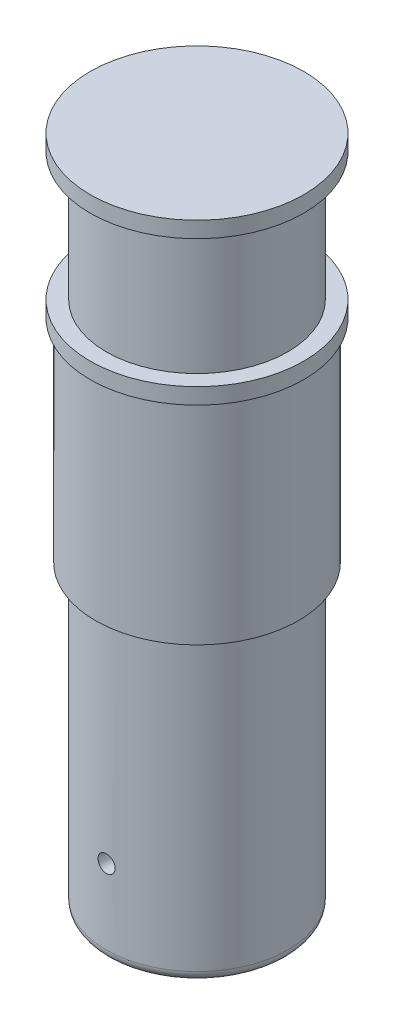
ISO-10303-21;
HEADER;
FILE_DESCRIPTION(('STEP AP214'),'2;1');
FILE_NAME('part.step','',(''),(''),'','','');
FILE_SCHEMA(('AUTOMOTIVE_DESIGN { 1 0 10303 214 1 1 1 1 }'));
ENDSEC;
DATA;
#1=APPLICATION_CONTEXT('core data for automotive mechanical design processes');
#2=APPLICATION_PROTOCOL_DEFINITION('international standard','automotive_design',2000,#1);
#3=PRODUCT_CONTEXT('',#1,'mechanical');
#4=PRODUCT('Part','Part','',(#3));
#5=PRODUCT_RELATED_PRODUCT_CATEGORY('part','',(#4));
#6=PRODUCT_DEFINITION_FORMATION('','',#4);
#7=PRODUCT_DEFINITION_CONTEXT('part definition',#1,'design');
#8=PRODUCT_DEFINITION('design','',#6,#7);
#9=PRODUCT_DEFINITION_SHAPE('','',#8);
#10=(LENGTH_UNIT() NAMED_UNIT(*) SI_UNIT(.MILLI.,.METRE.));
#11=(NAMED_UNIT(*) PLANE_ANGLE_UNIT() SI_UNIT($,.RADIAN.));
#12=(NAMED_UNIT(*) SI_UNIT($,.STERADIAN.) SOLID_ANGLE_UNIT());
#13=UNCERTAINTY_MEASURE_WITH_UNIT(LENGTH_MEASURE(1.E-05),#10,'distance_accuracy_value','');
#14=(GEOMETRIC_REPRESENTATION_CONTEXT(3) GLOBAL_UNCERTAINTY_ASSIGNED_CONTEXT((#13)) GLOBAL_UNIT_ASSIGNED_CONTEXT((#10,
#11,#12)) REPRESENTATION_CONTEXT('',''));
#15=CARTESIAN_POINT('',(0.,0.,0.));
#16=DIRECTION('',(0.,0.,1.));
#17=DIRECTION('',(1.,0.,0.));
#18=AXIS2_PLACEMENT_3D('',#15,#16,#17);
#19=CARTESIAN_POINT('',(0.,-34.,0.));
#20=DIRECTION('',(0.,-1.,0.));
#21=DIRECTION('',(1.,0.,0.));
#22=AXIS2_PLACEMENT_3D('',#19,#20,#21);
#23=PLANE('',#22);
#24=CARTESIAN_POINT('',(0.,-34.,0.));
#25=DIRECTION('',(0.,1.,0.));
#26=DIRECTION('',(-1.,0.,0.));
#27=AXIS2_PLACEMENT_3D('',#24,#25,#26);
#28=CIRCLE('',#27,4.);
#29=CARTESIAN_POINT('',(-4.,-34.,0.));
#30=VERTEX_POINT('',#29);
#31=EDGE_CURVE('E55',#30,#30,#28,.T.);
#32=ORIENTED_EDGE('',*,*,#31,.F.);
#33=EDGE_LOOP('',(#32));
#34=FACE_BOUND('',#33,.T.);
#35=ADVANCED_FACE('F35',(#34),#23,.T.);
#36=CARTESIAN_POINT('',(0.,15.,0.));
#37=DIRECTION('',(0.,1.,0.));
#38=DIRECTION('',(-1.,0.,0.));
#39=AXIS2_PLACEMENT_3D('',#36,#37,#38);
#40=CYLINDRICAL_SURFACE('',#39,4.);
#41=CARTESIAN_POINT('',(-0.799999999999998,-40.,3.91918358845308));
#42=CARTESIAN_POINT('',(-0.799998356700834,-39.9555484996144,3.91918447235146));
#43=CARTESIAN_POINT('',(-0.796282537378923,-39.9110763013548,3.9199480667753));
#44=CARTESIAN_POINT('',(-0.781529826870666,-39.8233899959053,3.9229154510821));
#45=CARTESIAN_POINT('',(-0.770487077656943,-39.7801769242951,3.92512039333066));
#46=CARTESIAN_POINT('',(-0.741436626094188,-39.6962901573097,3.93071098960285));
#47=CARTESIAN_POINT('',(-0.723435851321664,-39.6556139827721,3.9340954689225));
#48=CARTESIAN_POINT('',(-0.680999286136832,-39.5778601242443,3.94166239589137));
#49=CARTESIAN_POINT('',(-0.656563854881034,-39.5407822395702,3.94584479900011));
#50=CARTESIAN_POINT('',(-0.601583260522629,-39.4707511969164,3.95460239754144));
#51=CARTESIAN_POINT('',(-0.57096452473062,-39.4378563296927,3.9591819026946));
#52=CARTESIAN_POINT('',(-0.504645431217075,-39.377633973137,3.96817977842416));
#53=CARTESIAN_POINT('',(-0.46894471758239,-39.3503068740663,3.97259813768756));
#54=CARTESIAN_POINT('',(-0.393089084739389,-39.3017695858972,3.98082237133958));
#55=CARTESIAN_POINT('',(-0.352898054137759,-39.2806147889467,3.98462257153216));
#56=CARTESIAN_POINT('',(-0.269443320309812,-39.2453800503615,3.9911338950693));
#57=CARTESIAN_POINT('',(-0.226179905136437,-39.2312994464792,3.99384512035302));
#58=CARTESIAN_POINT('',(-0.13841341862279,-39.2107942451043,3.99784256550728));
#59=CARTESIAN_POINT('',(-0.0939341913718464,-39.2042712179432,3.999147090305));
#60=CARTESIAN_POINT('',(-0.0044948547500249,-39.1987592385293,4.00024736946885));
#61=CARTESIAN_POINT('',(0.0404652078654787,-39.1997695602833,4.00004326922208));
#62=CARTESIAN_POINT('',(0.128913600594875,-39.2092209441724,3.99816347894812));
#63=CARTESIAN_POINT('',(0.172413771438781,-39.2175559817343,3.99650878692671));
#64=CARTESIAN_POINT('',(0.257385301264246,-39.2412520259671,3.99193741727527));
#65=CARTESIAN_POINT('',(0.298856578997707,-39.2566133137535,3.98902068915231));
#66=CARTESIAN_POINT('',(0.378895570560712,-39.2940240321178,3.98221836815967));
#67=CARTESIAN_POINT('',(0.417443339307121,-39.3161150008839,3.97832678540179));
#68=CARTESIAN_POINT('',(0.490324036687805,-39.3663272617893,3.97000375579028));
#69=CARTESIAN_POINT('',(0.524656479620001,-39.3944492478164,3.96557224684178));
#70=CARTESIAN_POINT('',(0.588761144842767,-39.4565068976868,3.95656771491568));
#71=CARTESIAN_POINT('',(0.618443453258906,-39.4905353493837,3.95199357166013));
#72=CARTESIAN_POINT('',(0.671694794541447,-39.5631331539606,3.94329257279008));
#73=CARTESIAN_POINT('',(0.695263711782201,-39.6017025927066,3.93916572563639));
#74=CARTESIAN_POINT('',(0.735650251841504,-39.6824166654575,3.93182437978339));
#75=CARTESIAN_POINT('',(0.752453318222167,-39.7245687741117,3.92861185250839));
#76=CARTESIAN_POINT('',(0.778712273302064,-39.8111770589792,3.92349181057018));
#77=CARTESIAN_POINT('',(0.788169119565312,-39.8556329340953,3.92158412582742));
#78=CARTESIAN_POINT('',(0.799332804828839,-39.9447718863992,3.91932383414262));
#79=CARTESIAN_POINT('',(0.801169487118328,-39.9894380594483,3.91894517645724));
#80=CARTESIAN_POINT('',(0.797390102648589,-40.0784385785597,3.91971588551083));
#81=CARTESIAN_POINT('',(0.791774458497952,-40.1227729432951,3.92086516560311));
#82=CARTESIAN_POINT('',(0.773361766459323,-40.2094149122338,3.92453785995932));
#83=CARTESIAN_POINT('',(0.760634096671436,-40.2517378744286,3.92704799211597));
#84=CARTESIAN_POINT('',(0.728432828246812,-40.333650623223,3.93314791481332));
#85=CARTESIAN_POINT('',(0.708958673898539,-40.3732401843486,3.93673779429016));
#86=CARTESIAN_POINT('',(0.663523313772475,-40.4491304879601,3.94465124769632));
#87=CARTESIAN_POINT('',(0.637480862386199,-40.4853816370407,3.94898377491923));
#88=CARTESIAN_POINT('',(0.579756457770165,-40.5530466496007,3.95786979061309));
#89=CARTESIAN_POINT('',(0.548073924115625,-40.5844600145994,3.96242330179055));
#90=CARTESIAN_POINT('',(0.479385818798308,-40.6420500473485,3.97132276695373));
#91=CARTESIAN_POINT('',(0.442305999143699,-40.66813892372,3.97566446166947));
#92=CARTESIAN_POINT('',(0.3642143173078,-40.7137167051997,3.98357702102896));
#93=CARTESIAN_POINT('',(0.323202620346801,-40.7332058874758,3.98714791804169));
#94=CARTESIAN_POINT('',(0.238642144659206,-40.7649030973973,3.99309835248853));
#95=CARTESIAN_POINT('',(0.195109338782459,-40.777152414581,3.99548463314083));
#96=CARTESIAN_POINT('',(0.106551563743927,-40.7941529981311,3.99882588750128));
#97=CARTESIAN_POINT('',(0.0615267749689689,-40.7989051675805,3.99978103359875));
#98=CARTESIAN_POINT('',(-0.0278983151229005,-40.8007415847703,4.00014832363297));
#99=CARTESIAN_POINT('',(-0.0722958497132035,-40.797957824365,3.99958702839481));
#100=CARTESIAN_POINT('',(-0.159976825052515,-40.7850928395617,3.99704034848254));
#101=CARTESIAN_POINT('',(-0.203260279802955,-40.7750117069215,3.99505498171481));
#102=CARTESIAN_POINT('',(-0.287402199796079,-40.7478968063267,3.98988398692));
#103=CARTESIAN_POINT('',(-0.328265954592226,-40.7308788974951,3.9867010979833));
#104=CARTESIAN_POINT('',(-0.406576976148763,-40.6903902069353,3.97947777698706));
#105=CARTESIAN_POINT('',(-0.44402397261393,-40.666918915277,3.97543727716702));
#106=CARTESIAN_POINT('',(-0.515091112085088,-40.6137444903503,3.96686079326295));
#107=CARTESIAN_POINT('',(-0.548639772893206,-40.5839469308906,3.96231786737714));
#108=CARTESIAN_POINT('',(-0.61030609420548,-40.5191598079234,3.95328978322898));
#109=CARTESIAN_POINT('',(-0.63842246656217,-40.484169016425,3.948804638903));
#110=CARTESIAN_POINT('',(-0.688713775564159,-40.4095365466399,3.94034674199971));
#111=CARTESIAN_POINT('',(-0.710821451711813,-40.3698488310717,3.93638002905062));
#112=CARTESIAN_POINT('',(-0.748019239430246,-40.2872537813602,3.92948189747556));
#113=CARTESIAN_POINT('',(-0.763115716783431,-40.2443494090417,3.92654954029565));
#114=CARTESIAN_POINT('',(-0.782935311883417,-40.1677900356507,3.92263744903138));
#115=CARTESIAN_POINT('',(-0.789323118818388,-40.1345716643908,3.92135027932529));
#116=CARTESIAN_POINT('',(-0.797856014368326,-40.0675728363571,3.91962302766424));
#117=CARTESIAN_POINT('',(-0.800001249249642,-40.0337923990015,3.91918291650621));
#118=CARTESIAN_POINT('',(-0.799999999999998,-40.,3.91918358845308));
#119=B_SPLINE_CURVE_WITH_KNOTS('',3,(#41,#42,#43,#44,#45,#46,#47,#48,#49,#50,#51,#52,#53,#54,
#55,#56,#57,#58,#59,#60,#61,#62,#63,#64,#65,#66,#67,#68,#69,#70,#71,#72,#73,#74,#75,#76,#77,#78,
#79,#80,#81,#82,#83,#84,#85,#86,#87,#88,#89,#90,#91,#92,#93,#94,#95,#96,#97,#98,#99,#100,#101,
#102,#103,#104,#105,#106,#107,#108,#109,#110,#111,#112,#113,#114,#115,#116,#117,#118),
.UNSPECIFIED.,.T.,.F.,(4,2,2,2,2,2,2,2,2,2,2,2,2,2,2,2,2,2,2,2,2,2,2,2,2,2,2,2,2,2,2,2,2,2,2,2,
2,2,4),(0.,0.133230771085217,0.266568191407413,0.399773198332442,0.532970771867863,
0.667858020367471,0.802754720263351,0.938827203479582,1.07488694595246,1.20915399104462,
1.34340809690996,1.47575031704828,1.60809783256997,1.7412793937584,1.8744762861405,
2.00999477407984,2.14551582496174,2.28132690536218,2.41712028010817,2.55059006241671,
2.68405227620734,2.81623473424652,2.94842808281516,3.08234447817614,3.21627466294164,
3.35226081384758,3.48824125302081,3.62343850860917,3.75861947751299,3.89144813929745,
4.02427513091402,4.15680013658358,4.28933561705744,4.42400921618474,4.55871471109821,
4.69487118861229,4.83090380069143,4.93219042907514,5.03347356545368),.UNSPECIFIED.);
#120=CARTESIAN_POINT('',(-0.799999999999998,-40.,3.91918358845308));
#121=VERTEX_POINT('',#120);
#122=EDGE_CURVE('E85',#121,#121,#119,.T.);
#123=ORIENTED_EDGE('',*,*,#122,.F.);
#124=EDGE_LOOP('',(#123));
#125=FACE_BOUND('',#124,.T.);
#126=CARTESIAN_POINT('',(0.,-47.,0.));
#127=DIRECTION('',(0.,-1.,0.));
#128=DIRECTION('',(1.,0.,0.));
#129=AXIS2_PLACEMENT_3D('',#126,#127,#128);
#130=CIRCLE('',#129,4.);
#131=CARTESIAN_POINT('',(4.,-47.,0.));
#132=VERTEX_POINT('',#131);
#133=EDGE_CURVE('E10',#132,#132,#130,.T.);
#134=ORIENTED_EDGE('',*,*,#133,.T.);
#135=EDGE_LOOP('',(#134));
#136=FACE_BOUND('',#135,.T.);
#137=ORIENTED_EDGE('',*,*,#31,.T.);
#138=EDGE_LOOP('',(#137));
#139=FACE_BOUND('',#138,.T.);
#140=ADVANCED_FACE('F98',(#125,#136,#139),#40,.F.);
#141=CARTESIAN_POINT('',(-4.,-48.,0.));
#142=DIRECTION('',(0.,-1.,0.));
#143=DIRECTION('',(1.,0.,0.));
#144=AXIS2_PLACEMENT_3D('',#141,#142,#143);
#145=PLANE('',#144);
#146=CARTESIAN_POINT('',(0.,-48.,0.));
#147=DIRECTION('',(0.,-1.,0.));
#148=DIRECTION('',(1.,0.,0.));
#149=AXIS2_PLACEMENT_3D('',#146,#147,#148);
#150=CIRCLE('',#149,7.5);
#151=CARTESIAN_POINT('',(7.5,-48.,0.));
#152=VERTEX_POINT('',#151);
#153=EDGE_CURVE('E42',#152,#152,#150,.T.);
#154=ORIENTED_EDGE('',*,*,#153,.T.);
#155=EDGE_LOOP('',(#154));
#156=FACE_BOUND('',#155,.T.);
#157=CARTESIAN_POINT('',(0.,-48.,0.));
#158=DIRECTION('',(0.,-1.,0.));
#159=DIRECTION('',(1.,0.,0.));
#160=AXIS2_PLACEMENT_3D('',#157,#158,#159);
#161=CIRCLE('',#160,5.);
#162=CARTESIAN_POINT('',(5.,-48.,0.));
#163=VERTEX_POINT('',#162);
#164=EDGE_CURVE('E46',#163,#163,#161,.F.);
#165=ORIENTED_EDGE('',*,*,#164,.T.);
#166=EDGE_LOOP('',(#165));
#167=FACE_BOUND('',#166,.T.);
#168=ADVANCED_FACE('F148',(#156,#167),#145,.T.);
#169=CARTESIAN_POINT('',(0.,15.,0.));
#170=DIRECTION('',(0.,1.,0.));
#171=DIRECTION('',(-1.,0.,0.));
#172=AXIS2_PLACEMENT_3D('',#169,#170,#171);
#173=CYLINDRICAL_SURFACE('',#172,8.5);
#174=CARTESIAN_POINT('',(-0.799999999999998,-40.,8.46226919921601));
#175=CARTESIAN_POINT('',(-0.799998051722512,-40.0448294504744,8.46226969576411));
#176=CARTESIAN_POINT('',(-0.796219165065747,-40.0896888705061,8.46262926748447));
#177=CARTESIAN_POINT('',(-0.781200993113277,-40.1781649174772,8.46402857330807));
#178=CARTESIAN_POINT('',(-0.769953399606894,-40.2217801039114,8.46506906484979));
#179=CARTESIAN_POINT('',(-0.740327396358505,-40.3064735463154,8.46771133055027));
#180=CARTESIAN_POINT('',(-0.721953204843276,-40.3475532863724,8.4693127726287));
#181=CARTESIAN_POINT('',(-0.678603466147712,-40.4260364054319,8.47289608609247));
#182=CARTESIAN_POINT('',(-0.653629267431372,-40.463440533269,8.4748778797446));
#183=CARTESIAN_POINT('',(-0.597701438818431,-40.5336409476072,8.47900578910204));
#184=CARTESIAN_POINT('',(-0.566730820426073,-40.5664236740419,8.48115236095883));
#185=CARTESIAN_POINT('',(-0.499725485884899,-40.6263340325935,8.48536380908184));
#186=CARTESIAN_POINT('',(-0.46369054210384,-40.6534614103765,8.48742868167047));
#187=CARTESIAN_POINT('',(-0.38749709610742,-40.7013373241769,8.49124852243702));
#188=CARTESIAN_POINT('',(-0.347331076049264,-40.7220739460507,8.49300290922283));
#189=CARTESIAN_POINT('',(-0.264067927363772,-40.7565034981943,8.49599915855955));
#190=CARTESIAN_POINT('',(-0.220970862667862,-40.7701965820408,8.49724103228512));
#191=CARTESIAN_POINT('',(-0.133205360945527,-40.790110830208,8.49906913274005));
#192=CARTESIAN_POINT('',(-0.0885419946435105,-40.7963541607351,8.49965730415378));
#193=CARTESIAN_POINT('',(0.00120227418409292,-40.8012602399367,8.50011833475565));
#194=CARTESIAN_POINT('',(0.0462831670020106,-40.7999231644192,8.49999121053323));
#195=CARTESIAN_POINT('',(0.135432398645051,-40.7897244295111,8.49903756962443));
#196=CARTESIAN_POINT('',(0.179503491284399,-40.7808866057248,8.49821326843021));
#197=CARTESIAN_POINT('',(0.265534024050682,-40.7559743541366,8.49596048642509));
#198=CARTESIAN_POINT('',(0.307493439447396,-40.7398998416064,8.49453199854028));
#199=CARTESIAN_POINT('',(0.388184944500137,-40.7009442134983,8.49122767231171));
#200=CARTESIAN_POINT('',(0.426911889485646,-40.6780525027847,8.48935113853182));
#201=CARTESIAN_POINT('',(0.499982995623232,-40.6261199827266,8.48536140315661));
#202=CARTESIAN_POINT('',(0.534327042989776,-40.5970790137916,8.48324819541961));
#203=CARTESIAN_POINT('',(0.597796970011166,-40.5335381844106,8.47901271675067));
#204=CARTESIAN_POINT('',(0.626902104101888,-40.499017597794,8.47689044244263));
#205=CARTESIAN_POINT('',(0.678907530961676,-40.4255694435251,8.47288422269225));
#206=CARTESIAN_POINT('',(0.701807816327675,-40.3866418706149,8.47100027753427));
#207=CARTESIAN_POINT('',(0.740753132706015,-40.3054693259134,8.46768378909325));
#208=CARTESIAN_POINT('',(0.756796958762966,-40.2632237725626,8.46625132516519));
#209=CARTESIAN_POINT('',(0.781557909956949,-40.1766219934651,8.46400160564135));
#210=CARTESIAN_POINT('',(0.79027523234215,-40.1322658245756,8.46318433348309));
#211=CARTESIAN_POINT('',(0.800109195830605,-40.0428838260686,8.46226033917821));
#212=CARTESIAN_POINT('',(0.801254825170939,-39.9978612126451,8.46215090709925));
#213=CARTESIAN_POINT('',(0.795988938910483,-39.9082646263524,8.46264783208174));
#214=CARTESIAN_POINT('',(0.789577513570647,-39.8636906481313,8.46325418059395));
#215=CARTESIAN_POINT('',(0.769403735601284,-39.7763406430785,8.4651118796448));
#216=CARTESIAN_POINT('',(0.755655022983682,-39.7335614384168,8.46636203319978));
#217=CARTESIAN_POINT('',(0.721210848959733,-39.6509166722136,8.46936550354304));
#218=CARTESIAN_POINT('',(0.700515246112513,-39.6110511700162,8.47111883057599));
#219=CARTESIAN_POINT('',(0.652691871459717,-39.5352331189511,8.47493765726395));
#220=CARTESIAN_POINT('',(0.625544850059138,-39.4992927594832,8.47700408432026));
#221=CARTESIAN_POINT('',(0.565616911529251,-39.4324686633566,8.48121320580405));
#222=CARTESIAN_POINT('',(0.532835870865703,-39.4015850376034,8.48335590190302));
#223=CARTESIAN_POINT('',(0.462444852074463,-39.3456514961313,8.48748427411384));
#224=CARTESIAN_POINT('',(0.424819835056005,-39.3206204626659,8.48946942870376));
#225=CARTESIAN_POINT('',(0.345883423508183,-39.2772324383318,8.49305148216123));
#226=CARTESIAN_POINT('',(0.304572074448177,-39.2588753651568,8.49464838581679));
#227=CARTESIAN_POINT('',(0.219502240600614,-39.22938850786,8.4972716387645));
#228=CARTESIAN_POINT('',(0.175747773139529,-39.2182472177639,8.49829889601203));
#229=CARTESIAN_POINT('',(0.08697908294707,-39.2034706151011,8.49967082390552));
#230=CARTESIAN_POINT('',(0.0419648913231325,-39.199835117353,8.5000155113917));
#231=CARTESIAN_POINT('',(-0.0478597500803932,-39.2001757325819,8.49998346741485));
#232=CARTESIAN_POINT('',(-0.0926703150713291,-39.2041224905255,8.49960951818341));
#233=CARTESIAN_POINT('',(-0.180988972181257,-39.2194541543759,8.4981877095337));
#234=CARTESIAN_POINT('',(-0.224497062973245,-39.2308390678607,8.49713984942885));
#235=CARTESIAN_POINT('',(-0.308976287688148,-39.2607159765181,8.49448768250067));
#236=CARTESIAN_POINT('',(-0.349947684913883,-39.2792072326282,8.49288343354369));
#237=CARTESIAN_POINT('',(-0.428209622450279,-39.3227687314572,8.48929755730403));
#238=CARTESIAN_POINT('',(-0.465500197901198,-39.3478389113598,8.48731593362461));
#239=CARTESIAN_POINT('',(-0.535492360861084,-39.4039568083287,8.48318829962731));
#240=CARTESIAN_POINT('',(-0.568176415559751,-39.4350263503164,8.48104170688272));
#241=CARTESIAN_POINT('',(-0.627880694936032,-39.5022190268229,8.47683101907694));
#242=CARTESIAN_POINT('',(-0.654899554082034,-39.5383433762554,8.47476694400251));
#243=CARTESIAN_POINT('',(-0.702553986444432,-39.6147092230948,8.47094991592882));
#244=CARTESIAN_POINT('',(-0.723174805318652,-39.6549599562504,8.46919768597343));
#245=CARTESIAN_POINT('',(-0.757338072342069,-39.7383427331831,8.46621142126263));
#246=CARTESIAN_POINT('',(-0.770888562085653,-39.7814714403578,8.46497679811132));
#247=CARTESIAN_POINT('',(-0.787120432851149,-39.8540402104196,8.46347920213285));
#248=CARTESIAN_POINT('',(-0.791943737627453,-39.8830152475015,8.46302757434083));
#249=CARTESIAN_POINT('',(-0.798384153084581,-39.941322576651,8.46242241090119));
#250=CARTESIAN_POINT('',(-0.800001275332632,-39.9706548674292,8.46226887417812));
#251=CARTESIAN_POINT('',(-0.799999999999998,-40.,8.46226919921601));
#252=B_SPLINE_CURVE_WITH_KNOTS('',3,(#174,#175,#176,#177,#178,#179,#180,#181,#182,#183,#184,
#185,#186,#187,#188,#189,#190,#191,#192,#193,#194,#195,#196,#197,#198,#199,#200,#201,#202,#203,
#204,#205,#206,#207,#208,#209,#210,#211,#212,#213,#214,#215,#216,#217,#218,#219,#220,#221,#222,
#223,#224,#225,#226,#227,#228,#229,#230,#231,#232,#233,#234,#235,#236,#237,#238,#239,#240,#241,
#242,#243,#244,#245,#246,#247,#248,#249,#250,#251),.UNSPECIFIED.,.T.,.F.,(4,2,2,2,2,2,2,2,2,2,2,
2,2,2,2,2,2,2,2,2,2,2,2,2,2,2,2,2,2,2,2,2,2,2,2,2,2,2,4),(0.,0.134381195279678,
0.268912127568544,0.403363552343622,0.537787528220524,0.672598066512273,0.807414666232383,
0.942481102024319,1.07754459271543,1.21220520152603,1.34686268724088,1.48109385862726,
1.61532660165272,1.74976906471651,1.88421501736597,2.01918218015634,2.15414950397668,
2.28914053723453,2.42412793607295,2.55859823460518,2.69306692704944,2.82728650864342,
2.96150882315611,3.0961367699032,3.2307676689447,3.36582711281156,3.50088489100705,
3.63572677823608,3.77056533863313,3.90488291751552,4.03920063324044,4.17350438364815,
4.30780685175388,4.4426074272734,4.57744045769637,4.71258215065692,4.84756980033526,
4.93553537153734,5.02350062537776),.UNSPECIFIED.);
#253=CARTESIAN_POINT('',(-0.799999999999998,-40.,8.46226919921601));
#254=VERTEX_POINT('',#253);
#255=EDGE_CURVE('E93',#254,#254,#252,.T.);
#256=ORIENTED_EDGE('',*,*,#255,.F.);
#257=EDGE_LOOP('',(#256));
#258=FACE_BOUND('',#257,.T.);
#259=CARTESIAN_POINT('',(0.,-47.,0.));
#260=DIRECTION('',(0.,-1.,0.));
#261=DIRECTION('',(1.,0.,0.));
#262=AXIS2_PLACEMENT_3D('',#259,#260,#261);
#263=CIRCLE('',#262,8.5);
#264=CARTESIAN_POINT('',(8.5,-47.,0.));
#265=VERTEX_POINT('',#264);
#266=EDGE_CURVE('E50',#265,#265,#263,.F.);
#267=ORIENTED_EDGE('',*,*,#266,.T.);
#268=EDGE_LOOP('',(#267));
#269=FACE_BOUND('',#268,.T.);
#270=CARTESIAN_POINT('',(0.,-19.8,0.));
#271=DIRECTION('',(0.,1.,0.));
#272=DIRECTION('',(-1.,0.,0.));
#273=AXIS2_PLACEMENT_3D('',#270,#271,#272);
#274=CIRCLE('',#273,8.5);
#275=CARTESIAN_POINT('',(-8.49999999999999,-19.8,0.));
#276=VERTEX_POINT('',#275);
#277=EDGE_CURVE('E58',#276,#276,#274,.T.);
#278=ORIENTED_EDGE('',*,*,#277,.F.);
#279=EDGE_LOOP('',(#278));
#280=FACE_BOUND('',#279,.T.);
#281=ADVANCED_FACE('F145',(#258,#269,#280),#173,.T.);
#282=CARTESIAN_POINT('',(-8.49999999999999,-19.8,0.));
#283=DIRECTION('',(0.,-1.,0.));
#284=DIRECTION('',(1.,0.,0.));
#285=AXIS2_PLACEMENT_3D('',#282,#283,#284);
#286=PLANE('',#285);
#287=ORIENTED_EDGE('',*,*,#277,.T.);
#288=EDGE_LOOP('',(#287));
#289=FACE_BOUND('',#288,.T.);
#290=CARTESIAN_POINT('',(0.,-19.8,0.));
#291=DIRECTION('',(0.,1.,0.));
#292=DIRECTION('',(-1.,0.,0.));
#293=AXIS2_PLACEMENT_3D('',#290,#291,#292);
#294=CIRCLE('',#293,9.5);
#295=CARTESIAN_POINT('',(-9.49999999999999,-19.8,0.));
#296=VERTEX_POINT('',#295);
#297=EDGE_CURVE('E61',#296,#296,#294,.T.);
#298=ORIENTED_EDGE('',*,*,#297,.F.);
#299=EDGE_LOOP('',(#298));
#300=FACE_BOUND('',#299,.T.);
#301=ADVANCED_FACE('F141',(#289,#300),#286,.T.);
#302=CARTESIAN_POINT('',(0.,15.,0.));
#303=DIRECTION('',(0.,1.,0.));
#304=DIRECTION('',(-1.,0.,0.));
#305=AXIS2_PLACEMENT_3D('',#302,#303,#304);
#306=CYLINDRICAL_SURFACE('',#305,9.49999999999999);
#307=ORIENTED_EDGE('',*,*,#297,.T.);
#308=EDGE_LOOP('',(#307));
#309=FACE_BOUND('',#308,.T.);
#310=CARTESIAN_POINT('',(0.,0.,0.));
#311=DIRECTION('',(0.,1.,0.));
#312=DIRECTION('',(-1.,0.,0.));
#313=AXIS2_PLACEMENT_3D('',#310,#311,#312);
#314=CIRCLE('',#313,9.49999999999999);
#315=CARTESIAN_POINT('',(-9.49999999999999,0.,0.));
#316=VERTEX_POINT('',#315);
#317=EDGE_CURVE('E64',#316,#316,#314,.T.);
#318=ORIENTED_EDGE('',*,*,#317,.F.);
#319=EDGE_LOOP('',(#318));
#320=FACE_BOUND('',#319,.T.);
#321=ADVANCED_FACE('F137',(#309,#320),#306,.T.);
#322=CARTESIAN_POINT('',(-9.49999999999999,0.,0.));
#323=DIRECTION('',(0.,-1.,0.));
#324=DIRECTION('',(1.,0.,0.));
#325=AXIS2_PLACEMENT_3D('',#322,#323,#324);
#326=PLANE('',#325);
#327=ORIENTED_EDGE('',*,*,#317,.T.);
#328=EDGE_LOOP('',(#327));
#329=FACE_BOUND('',#328,.T.);
#330=CARTESIAN_POINT('',(0.,0.,0.));
#331=DIRECTION('',(0.,1.,0.));
#332=DIRECTION('',(-1.,0.,0.));
#333=AXIS2_PLACEMENT_3D('',#330,#331,#332);
#334=CIRCLE('',#333,10.);
#335=CARTESIAN_POINT('',(-10.,0.,0.));
#336=VERTEX_POINT('',#335);
#337=EDGE_CURVE('E67',#336,#336,#334,.T.);
#338=ORIENTED_EDGE('',*,*,#337,.F.);
#339=EDGE_LOOP('',(#338));
#340=FACE_BOUND('',#339,.T.);
#341=ADVANCED_FACE('F133',(#329,#340),#326,.T.);
#342=CARTESIAN_POINT('',(0.,15.,0.));
#343=DIRECTION('',(0.,1.,0.));
#344=DIRECTION('',(-1.,0.,0.));
#345=AXIS2_PLACEMENT_3D('',#342,#343,#344);
#346=CYLINDRICAL_SURFACE('',#345,10.);
#347=ORIENTED_EDGE('',*,*,#337,.T.);
#348=EDGE_LOOP('',(#347));
#349=FACE_BOUND('',#348,.T.);
#350=CARTESIAN_POINT('',(0.,1.5,0.));
#351=DIRECTION('',(0.,1.,0.));
#352=DIRECTION('',(-1.,0.,0.));
#353=AXIS2_PLACEMENT_3D('',#350,#351,#352);
#354=CIRCLE('',#353,10.);
#355=CARTESIAN_POINT('',(-10.,1.5,0.));
#356=VERTEX_POINT('',#355);
#357=EDGE_CURVE('E70',#356,#356,#354,.T.);
#358=ORIENTED_EDGE('',*,*,#357,.F.);
#359=EDGE_LOOP('',(#358));
#360=FACE_BOUND('',#359,.T.);
#361=ADVANCED_FACE('F129',(#349,#360),#346,.T.);
#362=CARTESIAN_POINT('',(-10.,1.5,0.));
#363=DIRECTION('',(0.,1.,0.));
#364=DIRECTION('',(-1.,0.,0.));
#365=AXIS2_PLACEMENT_3D('',#362,#363,#364);
#366=PLANE('',#365);
#367=ORIENTED_EDGE('',*,*,#357,.T.);
#368=EDGE_LOOP('',(#367));
#369=FACE_BOUND('',#368,.T.);
#370=CARTESIAN_POINT('',(0.,1.5,0.));
#371=DIRECTION('',(0.,1.,0.));
#372=DIRECTION('',(-1.,0.,0.));
#373=AXIS2_PLACEMENT_3D('',#370,#371,#372);
#374=CIRCLE('',#373,8.5);
#375=CARTESIAN_POINT('',(-8.5,1.5,0.));
#376=VERTEX_POINT('',#375);
#377=EDGE_CURVE('E73',#376,#376,#374,.T.);
#378=ORIENTED_EDGE('',*,*,#377,.F.);
#379=EDGE_LOOP('',(#378));
#380=FACE_BOUND('',#379,.T.);
#381=ADVANCED_FACE('F125',(#369,#380),#366,.T.);
#382=CARTESIAN_POINT('',(0.,15.,0.));
#383=DIRECTION('',(0.,1.,0.));
#384=DIRECTION('',(-1.,0.,0.));
#385=AXIS2_PLACEMENT_3D('',#382,#383,#384);
#386=CYLINDRICAL_SURFACE('',#385,8.5);
#387=ORIENTED_EDGE('',*,*,#377,.T.);
#388=EDGE_LOOP('',(#387));
#389=FACE_BOUND('',#388,.T.);
#390=CARTESIAN_POINT('',(0.,13.5,0.));
#391=DIRECTION('',(0.,1.,0.));
#392=DIRECTION('',(-1.,0.,0.));
#393=AXIS2_PLACEMENT_3D('',#390,#391,#392);
#394=CIRCLE('',#393,8.5);
#395=CARTESIAN_POINT('',(-8.5,13.5,0.));
#396=VERTEX_POINT('',#395);
#397=EDGE_CURVE('E76',#396,#396,#394,.T.);
#398=ORIENTED_EDGE('',*,*,#397,.F.);
#399=EDGE_LOOP('',(#398));
#400=FACE_BOUND('',#399,.T.);
#401=ADVANCED_FACE('F121',(#389,#400),#386,.T.);
#402=CARTESIAN_POINT('',(-8.5,13.5,0.));
#403=DIRECTION('',(0.,-1.,0.));
#404=DIRECTION('',(1.,0.,0.));
#405=AXIS2_PLACEMENT_3D('',#402,#403,#404);
#406=PLANE('',#405);
#407=ORIENTED_EDGE('',*,*,#397,.T.);
#408=EDGE_LOOP('',(#407));
#409=FACE_BOUND('',#408,.T.);
#410=CARTESIAN_POINT('',(0.,13.5,0.));
#411=DIRECTION('',(0.,1.,0.));
#412=DIRECTION('',(-1.,0.,0.));
#413=AXIS2_PLACEMENT_3D('',#410,#411,#412);
#414=CIRCLE('',#413,10.);
#415=CARTESIAN_POINT('',(-10.,13.5,0.));
#416=VERTEX_POINT('',#415);
#417=EDGE_CURVE('E79',#416,#416,#414,.T.);
#418=ORIENTED_EDGE('',*,*,#417,.F.);
#419=EDGE_LOOP('',(#418));
#420=FACE_BOUND('',#419,.T.);
#421=ADVANCED_FACE('F117',(#409,#420),#406,.T.);
#422=CARTESIAN_POINT('',(0.,15.,0.));
#423=DIRECTION('',(0.,1.,0.));
#424=DIRECTION('',(-1.,0.,0.));
#425=AXIS2_PLACEMENT_3D('',#422,#423,#424);
#426=CYLINDRICAL_SURFACE('',#425,10.);
#427=ORIENTED_EDGE('',*,*,#417,.T.);
#428=EDGE_LOOP('',(#427));
#429=FACE_BOUND('',#428,.T.);
#430=CARTESIAN_POINT('',(0.,15.,0.));
#431=DIRECTION('',(0.,1.,0.));
#432=DIRECTION('',(-1.,0.,0.));
#433=AXIS2_PLACEMENT_3D('',#430,#431,#432);
#434=CIRCLE('',#433,10.);
#435=CARTESIAN_POINT('',(-10.,15.,0.));
#436=VERTEX_POINT('',#435);
#437=EDGE_CURVE('E82',#436,#436,#434,.T.);
#438=ORIENTED_EDGE('',*,*,#437,.F.);
#439=EDGE_LOOP('',(#438));
#440=FACE_BOUND('',#439,.T.);
#441=ADVANCED_FACE('F113',(#429,#440),#426,.T.);
#442=CARTESIAN_POINT('',(-10.,15.,0.));
#443=DIRECTION('',(0.,1.,0.));
#444=DIRECTION('',(-1.,0.,0.));
#445=AXIS2_PLACEMENT_3D('',#442,#443,#444);
#446=PLANE('',#445);
#447=ORIENTED_EDGE('',*,*,#437,.T.);
#448=EDGE_LOOP('',(#447));
#449=FACE_BOUND('',#448,.T.);
#450=ADVANCED_FACE('F109',(#449),#446,.T.);
#451=CARTESIAN_POINT('',(0.,-47.,0.));
#452=DIRECTION('',(0.,-1.,0.));
#453=DIRECTION('',(1.,0.,0.));
#454=AXIS2_PLACEMENT_3D('',#451,#452,#453);
#455=TOROIDAL_SURFACE('',#454,7.5,1.);
#456=ORIENTED_EDGE('',*,*,#153,.F.);
#457=EDGE_LOOP('',(#456));
#458=FACE_BOUND('',#457,.T.);
#459=ORIENTED_EDGE('',*,*,#266,.F.);
#460=EDGE_LOOP('',(#459));
#461=FACE_BOUND('',#460,.T.);
#462=ADVANCED_FACE('F112',(#458,#461),#455,.T.);
#463=CARTESIAN_POINT('',(0.,-47.,0.));
#464=DIRECTION('',(0.,-1.,0.));
#465=DIRECTION('',(1.,0.,0.));
#466=AXIS2_PLACEMENT_3D('',#463,#464,#465);
#467=TOROIDAL_SURFACE('',#466,5.,1.);
#468=ORIENTED_EDGE('',*,*,#133,.F.);
#469=EDGE_LOOP('',(#468));
#470=FACE_BOUND('',#469,.T.);
#471=ORIENTED_EDGE('',*,*,#164,.F.);
#472=EDGE_LOOP('',(#471));
#473=FACE_BOUND('',#472,.T.);
#474=ADVANCED_FACE('F37',(#470,#473),#467,.T.);
#475=CARTESIAN_POINT('',(0.,-40.,0.));
#476=DIRECTION('',(0.,0.,-1.));
#477=DIRECTION('',(-1.,0.,0.));
#478=AXIS2_PLACEMENT_3D('',#475,#476,#477);
#479=CYLINDRICAL_SURFACE('',#478,0.799999999999998);
#480=ORIENTED_EDGE('',*,*,#122,.T.);
#481=EDGE_LOOP('',(#480));
#482=FACE_BOUND('',#481,.T.);
#483=ORIENTED_EDGE('',*,*,#255,.T.);
#484=EDGE_LOOP('',(#483));
#485=FACE_BOUND('',#484,.T.);
#486=ADVANCED_FACE('F102',(#482,#485),#479,.F.);
#487=CLOSED_SHELL('',(#35,#140,#168,#281,#301,#321,#341,#361,#381,#401,#421,#441,#450,#462,#474,#486));
#488=MANIFOLD_SOLID_BREP('B2',#487);
#489=ADVANCED_BREP_SHAPE_REPRESENTATION('',(#18,#488),#14);
#490=SHAPE_DEFINITION_REPRESENTATION(#9,#489);
ENDSEC;
END-ISO-10303-21;
